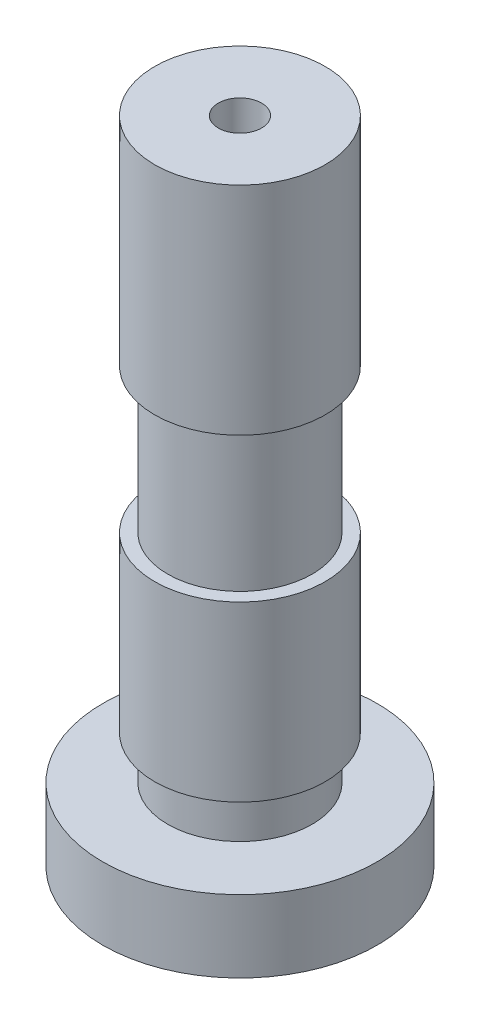
ISO-10303-21;
HEADER;
FILE_DESCRIPTION(('STEP AP214'),'2;1');
FILE_NAME('part.step','',(''),(''),'','','');
FILE_SCHEMA(('AUTOMOTIVE_DESIGN { 1 0 10303 214 1 1 1 1 }'));
ENDSEC;
DATA;
#1=APPLICATION_CONTEXT('core data for automotive mechanical design processes');
#2=APPLICATION_PROTOCOL_DEFINITION('international standard','automotive_design',2000,#1);
#3=PRODUCT_CONTEXT('',#1,'mechanical');
#4=PRODUCT('Part','Part','',(#3));
#5=PRODUCT_RELATED_PRODUCT_CATEGORY('part','',(#4));
#6=PRODUCT_DEFINITION_FORMATION('','',#4);
#7=PRODUCT_DEFINITION_CONTEXT('part definition',#1,'design');
#8=PRODUCT_DEFINITION('design','',#6,#7);
#9=PRODUCT_DEFINITION_SHAPE('','',#8);
#10=(LENGTH_UNIT() NAMED_UNIT(*) SI_UNIT(.MILLI.,.METRE.));
#11=(NAMED_UNIT(*) PLANE_ANGLE_UNIT() SI_UNIT($,.RADIAN.));
#12=(NAMED_UNIT(*) SI_UNIT($,.STERADIAN.) SOLID_ANGLE_UNIT());
#13=UNCERTAINTY_MEASURE_WITH_UNIT(LENGTH_MEASURE(1.E-05),#10,'distance_accuracy_value','');
#14=(GEOMETRIC_REPRESENTATION_CONTEXT(3) GLOBAL_UNCERTAINTY_ASSIGNED_CONTEXT((#13)) GLOBAL_UNIT_ASSIGNED_CONTEXT((#10,
#11,#12)) REPRESENTATION_CONTEXT('',''));
#15=CARTESIAN_POINT('',(0.,0.,0.));
#16=DIRECTION('',(0.,0.,1.));
#17=DIRECTION('',(1.,0.,0.));
#18=AXIS2_PLACEMENT_3D('',#15,#16,#17);
#19=CARTESIAN_POINT('',(0.,0.,0.));
#20=DIRECTION('',(0.,1.,0.));
#21=DIRECTION('',(0.,0.,1.));
#22=AXIS2_PLACEMENT_3D('',#19,#20,#21);
#23=PLANE('',#22);
#24=CARTESIAN_POINT('',(0.,0.,0.));
#25=DIRECTION('',(0.,-1.,0.));
#26=DIRECTION('',(0.,0.,-1.));
#27=AXIS2_PLACEMENT_3D('',#24,#25,#26);
#28=CIRCLE('',#27,1.5);
#29=CARTESIAN_POINT('',(0.,0.,-1.5));
#30=VERTEX_POINT('',#29);
#31=EDGE_CURVE('E94',#30,#30,#28,.T.);
#32=ORIENTED_EDGE('',*,*,#31,.F.);
#33=EDGE_LOOP('',(#32));
#34=FACE_BOUND('',#33,.T.);
#35=CARTESIAN_POINT('',(0.,0.,0.));
#36=DIRECTION('',(0.,1.,0.));
#37=DIRECTION('',(0.,0.,1.));
#38=AXIS2_PLACEMENT_3D('',#35,#36,#37);
#39=CIRCLE('',#38,9.5);
#40=CARTESIAN_POINT('',(0.,0.,9.50000000000002));
#41=VERTEX_POINT('',#40);
#42=EDGE_CURVE('E10',#41,#41,#39,.T.);
#43=ORIENTED_EDGE('',*,*,#42,.F.);
#44=EDGE_LOOP('',(#43));
#45=FACE_BOUND('',#44,.T.);
#46=ADVANCED_FACE('F36',(#34,#45),#23,.F.);
#47=CARTESIAN_POINT('',(0.,14.646751200337,0.));
#48=DIRECTION('',(0.,1.,0.));
#49=DIRECTION('',(0.,0.,1.));
#50=AXIS2_PLACEMENT_3D('',#47,#48,#49);
#51=CYLINDRICAL_SURFACE('',#50,9.5);
#52=CARTESIAN_POINT('',(0.,5.,0.));
#53=DIRECTION('',(0.,1.,0.));
#54=DIRECTION('',(0.,0.,1.));
#55=AXIS2_PLACEMENT_3D('',#52,#53,#54);
#56=CIRCLE('',#55,9.5);
#57=CARTESIAN_POINT('',(0.,5.,9.50000000000002));
#58=VERTEX_POINT('',#57);
#59=EDGE_CURVE('E43',#58,#58,#56,.T.);
#60=ORIENTED_EDGE('',*,*,#59,.F.);
#61=EDGE_LOOP('',(#60));
#62=FACE_BOUND('',#61,.T.);
#63=ORIENTED_EDGE('',*,*,#42,.T.);
#64=EDGE_LOOP('',(#63));
#65=FACE_BOUND('',#64,.T.);
#66=ADVANCED_FACE('F114',(#62,#65),#51,.T.);
#67=CARTESIAN_POINT('',(9.50000000000014,5.,0.));
#68=DIRECTION('',(0.,-1.,0.));
#69=DIRECTION('',(0.,0.,-1.));
#70=AXIS2_PLACEMENT_3D('',#67,#68,#69);
#71=PLANE('',#70);
#72=CARTESIAN_POINT('',(0.,5.,0.));
#73=DIRECTION('',(0.,1.,0.));
#74=DIRECTION('',(0.,0.,1.));
#75=AXIS2_PLACEMENT_3D('',#72,#73,#74);
#76=CIRCLE('',#75,5.);
#77=CARTESIAN_POINT('',(0.,5.,5.00000000000001));
#78=VERTEX_POINT('',#77);
#79=EDGE_CURVE('E49',#78,#78,#76,.T.);
#80=ORIENTED_EDGE('',*,*,#79,.F.);
#81=EDGE_LOOP('',(#80));
#82=FACE_BOUND('',#81,.T.);
#83=ORIENTED_EDGE('',*,*,#59,.T.);
#84=EDGE_LOOP('',(#83));
#85=FACE_BOUND('',#84,.T.);
#86=ADVANCED_FACE('F118',(#82,#85),#71,.F.);
#87=CARTESIAN_POINT('',(0.,14.646751200337,0.));
#88=DIRECTION('',(0.,1.,0.));
#89=DIRECTION('',(0.,0.,1.));
#90=AXIS2_PLACEMENT_3D('',#87,#88,#89);
#91=CYLINDRICAL_SURFACE('',#90,5.);
#92=CARTESIAN_POINT('',(0.,8.,0.));
#93=DIRECTION('',(0.,1.,0.));
#94=DIRECTION('',(0.,0.,1.));
#95=AXIS2_PLACEMENT_3D('',#92,#93,#94);
#96=CIRCLE('',#95,5.);
#97=CARTESIAN_POINT('',(0.,8.,5.00000000000001));
#98=VERTEX_POINT('',#97);
#99=EDGE_CURVE('E55',#98,#98,#96,.T.);
#100=ORIENTED_EDGE('',*,*,#99,.F.);
#101=EDGE_LOOP('',(#100));
#102=FACE_BOUND('',#101,.T.);
#103=ORIENTED_EDGE('',*,*,#79,.T.);
#104=EDGE_LOOP('',(#103));
#105=FACE_BOUND('',#104,.T.);
#106=ADVANCED_FACE('F123',(#102,#105),#91,.T.);
#107=CARTESIAN_POINT('',(5.0000000000001,8.,0.));
#108=DIRECTION('',(0.,1.,0.));
#109=DIRECTION('',(0.,0.,1.));
#110=AXIS2_PLACEMENT_3D('',#107,#108,#109);
#111=PLANE('',#110);
#112=CARTESIAN_POINT('',(0.,8.,0.));
#113=DIRECTION('',(0.,1.,0.));
#114=DIRECTION('',(0.,0.,1.));
#115=AXIS2_PLACEMENT_3D('',#112,#113,#114);
#116=CIRCLE('',#115,5.9);
#117=CARTESIAN_POINT('',(0.,8.,5.90000000000001));
#118=VERTEX_POINT('',#117);
#119=EDGE_CURVE('E61',#118,#118,#116,.T.);
#120=ORIENTED_EDGE('',*,*,#119,.F.);
#121=EDGE_LOOP('',(#120));
#122=FACE_BOUND('',#121,.T.);
#123=ORIENTED_EDGE('',*,*,#99,.T.);
#124=EDGE_LOOP('',(#123));
#125=FACE_BOUND('',#124,.T.);
#126=ADVANCED_FACE('F129',(#122,#125),#111,.F.);
#127=CARTESIAN_POINT('',(0.,14.646751200337,0.));
#128=DIRECTION('',(0.,1.,0.));
#129=DIRECTION('',(0.,0.,1.));
#130=AXIS2_PLACEMENT_3D('',#127,#128,#129);
#131=CYLINDRICAL_SURFACE('',#130,5.9);
#132=CARTESIAN_POINT('',(0.,20.0000000000001,0.));
#133=DIRECTION('',(0.,1.,0.));
#134=DIRECTION('',(0.,0.,1.));
#135=AXIS2_PLACEMENT_3D('',#132,#133,#134);
#136=CIRCLE('',#135,5.9);
#137=CARTESIAN_POINT('',(0.,20.0000000000001,5.90000000000001));
#138=VERTEX_POINT('',#137);
#139=EDGE_CURVE('E65',#138,#138,#136,.T.);
#140=ORIENTED_EDGE('',*,*,#139,.F.);
#141=EDGE_LOOP('',(#140));
#142=FACE_BOUND('',#141,.T.);
#143=ORIENTED_EDGE('',*,*,#119,.T.);
#144=EDGE_LOOP('',(#143));
#145=FACE_BOUND('',#144,.T.);
#146=ADVANCED_FACE('F133',(#142,#145),#131,.T.);
#147=CARTESIAN_POINT('',(5.90000000000012,20.0000000000001,0.));
#148=DIRECTION('',(0.,-1.,0.));
#149=DIRECTION('',(0.,0.,-1.));
#150=AXIS2_PLACEMENT_3D('',#147,#148,#149);
#151=PLANE('',#150);
#152=CARTESIAN_POINT('',(0.,20.0000000000001,0.));
#153=DIRECTION('',(0.,1.,0.));
#154=DIRECTION('',(0.,0.,1.));
#155=AXIS2_PLACEMENT_3D('',#152,#153,#154);
#156=CIRCLE('',#155,5.);
#157=CARTESIAN_POINT('',(0.,20.0000000000001,5.00000000000001));
#158=VERTEX_POINT('',#157);
#159=EDGE_CURVE('E69',#158,#158,#156,.T.);
#160=ORIENTED_EDGE('',*,*,#159,.F.);
#161=EDGE_LOOP('',(#160));
#162=FACE_BOUND('',#161,.T.);
#163=ORIENTED_EDGE('',*,*,#139,.T.);
#164=EDGE_LOOP('',(#163));
#165=FACE_BOUND('',#164,.T.);
#166=ADVANCED_FACE('F137',(#162,#165),#151,.F.);
#167=CARTESIAN_POINT('',(0.,14.646751200337,0.));
#168=DIRECTION('',(0.,1.,0.));
#169=DIRECTION('',(0.,0.,1.));
#170=AXIS2_PLACEMENT_3D('',#167,#168,#169);
#171=CYLINDRICAL_SURFACE('',#170,5.);
#172=CARTESIAN_POINT('',(0.,30.,0.));
#173=DIRECTION('',(0.,1.,0.));
#174=DIRECTION('',(0.,0.,1.));
#175=AXIS2_PLACEMENT_3D('',#172,#173,#174);
#176=CIRCLE('',#175,5.);
#177=CARTESIAN_POINT('',(0.,30.,4.99999999999999));
#178=VERTEX_POINT('',#177);
#179=EDGE_CURVE('E73',#178,#178,#176,.T.);
#180=ORIENTED_EDGE('',*,*,#179,.F.);
#181=EDGE_LOOP('',(#180));
#182=FACE_BOUND('',#181,.T.);
#183=ORIENTED_EDGE('',*,*,#159,.T.);
#184=EDGE_LOOP('',(#183));
#185=FACE_BOUND('',#184,.T.);
#186=ADVANCED_FACE('F141',(#182,#185),#171,.T.);
#187=CARTESIAN_POINT('',(5.00000000000008,30.,0.));
#188=DIRECTION('',(0.,1.,0.));
#189=DIRECTION('',(0.,0.,1.));
#190=AXIS2_PLACEMENT_3D('',#187,#188,#189);
#191=PLANE('',#190);
#192=CARTESIAN_POINT('',(0.,30.,0.));
#193=DIRECTION('',(0.,1.,0.));
#194=DIRECTION('',(0.,0.,1.));
#195=AXIS2_PLACEMENT_3D('',#192,#193,#194);
#196=CIRCLE('',#195,5.9);
#197=CARTESIAN_POINT('',(0.,30.,5.89999999999999));
#198=VERTEX_POINT('',#197);
#199=EDGE_CURVE('E77',#198,#198,#196,.T.);
#200=ORIENTED_EDGE('',*,*,#199,.F.);
#201=EDGE_LOOP('',(#200));
#202=FACE_BOUND('',#201,.T.);
#203=ORIENTED_EDGE('',*,*,#179,.T.);
#204=EDGE_LOOP('',(#203));
#205=FACE_BOUND('',#204,.T.);
#206=ADVANCED_FACE('F145',(#202,#205),#191,.F.);
#207=CARTESIAN_POINT('',(0.,14.646751200337,0.));
#208=DIRECTION('',(0.,1.,0.));
#209=DIRECTION('',(0.,0.,1.));
#210=AXIS2_PLACEMENT_3D('',#207,#208,#209);
#211=CYLINDRICAL_SURFACE('',#210,5.9);
#212=CARTESIAN_POINT('',(0.,45.,0.));
#213=DIRECTION('',(0.,1.,0.));
#214=DIRECTION('',(0.,0.,1.));
#215=AXIS2_PLACEMENT_3D('',#212,#213,#214);
#216=CIRCLE('',#215,5.9);
#217=CARTESIAN_POINT('',(0.,45.,5.89999999999999));
#218=VERTEX_POINT('',#217);
#219=EDGE_CURVE('E81',#218,#218,#216,.T.);
#220=ORIENTED_EDGE('',*,*,#219,.F.);
#221=EDGE_LOOP('',(#220));
#222=FACE_BOUND('',#221,.T.);
#223=ORIENTED_EDGE('',*,*,#199,.T.);
#224=EDGE_LOOP('',(#223));
#225=FACE_BOUND('',#224,.T.);
#226=ADVANCED_FACE('F149',(#222,#225),#211,.T.);
#227=CARTESIAN_POINT('',(5.90000000000012,45.,0.));
#228=DIRECTION('',(0.,-1.,0.));
#229=DIRECTION('',(0.,0.,-1.));
#230=AXIS2_PLACEMENT_3D('',#227,#228,#229);
#231=PLANE('',#230);
#232=CARTESIAN_POINT('',(0.,45.,0.));
#233=DIRECTION('',(0.,1.,0.));
#234=DIRECTION('',(0.,0.,1.));
#235=AXIS2_PLACEMENT_3D('',#232,#233,#234);
#236=CIRCLE('',#235,1.5);
#237=CARTESIAN_POINT('',(0.,45.,1.49999999999998));
#238=VERTEX_POINT('',#237);
#239=EDGE_CURVE('E86',#238,#238,#236,.T.);
#240=ORIENTED_EDGE('',*,*,#239,.F.);
#241=EDGE_LOOP('',(#240));
#242=FACE_BOUND('',#241,.T.);
#243=ORIENTED_EDGE('',*,*,#219,.T.);
#244=EDGE_LOOP('',(#243));
#245=FACE_BOUND('',#244,.T.);
#246=ADVANCED_FACE('F153',(#242,#245),#231,.F.);
#247=CARTESIAN_POINT('',(0.,42.,0.));
#248=DIRECTION('',(0.,1.,0.));
#249=DIRECTION('',(0.,0.,1.));
#250=AXIS2_PLACEMENT_3D('',#247,#248,#249);
#251=CYLINDRICAL_SURFACE('',#250,1.5);
#252=CARTESIAN_POINT('',(0.,42.,0.));
#253=DIRECTION('',(0.,1.,0.));
#254=DIRECTION('',(0.,0.,1.));
#255=AXIS2_PLACEMENT_3D('',#252,#253,#254);
#256=CIRCLE('',#255,1.5);
#257=CARTESIAN_POINT('',(0.,42.,1.49999999999998));
#258=VERTEX_POINT('',#257);
#259=EDGE_CURVE('E85',#258,#258,#256,.T.);
#260=ORIENTED_EDGE('',*,*,#259,.F.);
#261=EDGE_LOOP('',(#260));
#262=FACE_BOUND('',#261,.T.);
#263=ORIENTED_EDGE('',*,*,#239,.T.);
#264=EDGE_LOOP('',(#263));
#265=FACE_BOUND('',#264,.T.);
#266=ADVANCED_FACE('F157',(#262,#265),#251,.F.);
#267=CARTESIAN_POINT('',(0.,42.,0.));
#268=DIRECTION('',(0.,1.,0.));
#269=DIRECTION('',(0.,0.,1.));
#270=AXIS2_PLACEMENT_3D('',#267,#268,#269);
#271=PLANE('',#270);
#272=ORIENTED_EDGE('',*,*,#259,.T.);
#273=EDGE_LOOP('',(#272));
#274=FACE_BOUND('',#273,.T.);
#275=ADVANCED_FACE('F108',(#274),#271,.T.);
#276=CARTESIAN_POINT('',(0.,3.,0.));
#277=DIRECTION('',(0.,-1.,0.));
#278=DIRECTION('',(0.,0.,-1.));
#279=AXIS2_PLACEMENT_3D('',#276,#277,#278);
#280=CYLINDRICAL_SURFACE('',#279,1.5);
#281=CARTESIAN_POINT('',(0.,3.,0.));
#282=DIRECTION('',(0.,-1.,0.));
#283=DIRECTION('',(0.,0.,-1.));
#284=AXIS2_PLACEMENT_3D('',#281,#282,#283);
#285=CIRCLE('',#284,1.5);
#286=CARTESIAN_POINT('',(0.,3.,-1.5));
#287=VERTEX_POINT('',#286);
#288=EDGE_CURVE('E90',#287,#287,#285,.T.);
#289=ORIENTED_EDGE('',*,*,#288,.F.);
#290=EDGE_LOOP('',(#289));
#291=FACE_BOUND('',#290,.T.);
#292=ORIENTED_EDGE('',*,*,#31,.T.);
#293=EDGE_LOOP('',(#292));
#294=FACE_BOUND('',#293,.T.);
#295=ADVANCED_FACE('F105',(#291,#294),#280,.F.);
#296=CARTESIAN_POINT('',(0.,3.,0.));
#297=DIRECTION('',(0.,-1.,0.));
#298=DIRECTION('',(0.,0.,-1.));
#299=AXIS2_PLACEMENT_3D('',#296,#297,#298);
#300=PLANE('',#299);
#301=ORIENTED_EDGE('',*,*,#288,.T.);
#302=EDGE_LOOP('',(#301));
#303=FACE_BOUND('',#302,.T.);
#304=ADVANCED_FACE('F103',(#303),#300,.T.);
#305=CLOSED_SHELL('',(#46,#66,#86,#106,#126,#146,#166,#186,#206,#226,#246,#266,#275,#295,#304));
#306=MANIFOLD_SOLID_BREP('B2',#305);
#307=ADVANCED_BREP_SHAPE_REPRESENTATION('',(#18,#306),#14);
#308=SHAPE_DEFINITION_REPRESENTATION(#9,#307);
ENDSEC;
END-ISO-10303-21;
